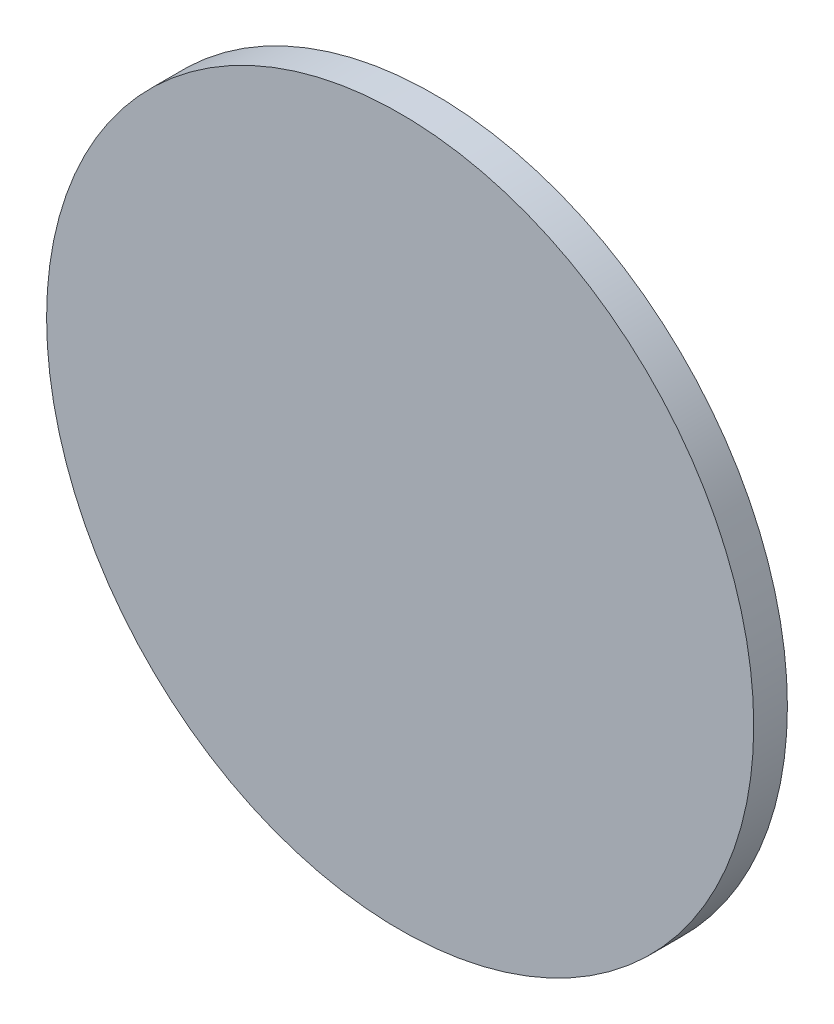
ISO-10303-21;
HEADER;
FILE_DESCRIPTION(('STEP AP214'),'2;1');
FILE_NAME('part.step','',(''),(''),'','','');
FILE_SCHEMA(('AUTOMOTIVE_DESIGN { 1 0 10303 214 1 1 1 1 }'));
ENDSEC;
DATA;
#1=APPLICATION_CONTEXT('core data for automotive mechanical design processes');
#2=APPLICATION_PROTOCOL_DEFINITION('international standard','automotive_design',2000,#1);
#3=PRODUCT_CONTEXT('',#1,'mechanical');
#4=PRODUCT('Part','Part','',(#3));
#5=PRODUCT_RELATED_PRODUCT_CATEGORY('part','',(#4));
#6=PRODUCT_DEFINITION_FORMATION('','',#4);
#7=PRODUCT_DEFINITION_CONTEXT('part definition',#1,'design');
#8=PRODUCT_DEFINITION('design','',#6,#7);
#9=PRODUCT_DEFINITION_SHAPE('','',#8);
#10=(LENGTH_UNIT() NAMED_UNIT(*) SI_UNIT(.MILLI.,.METRE.));
#11=(NAMED_UNIT(*) PLANE_ANGLE_UNIT() SI_UNIT($,.RADIAN.));
#12=(NAMED_UNIT(*) SI_UNIT($,.STERADIAN.) SOLID_ANGLE_UNIT());
#13=UNCERTAINTY_MEASURE_WITH_UNIT(LENGTH_MEASURE(1.E-05),#10,'distance_accuracy_value','');
#14=(GEOMETRIC_REPRESENTATION_CONTEXT(3) GLOBAL_UNCERTAINTY_ASSIGNED_CONTEXT((#13)) GLOBAL_UNIT_ASSIGNED_CONTEXT((#10,
#11,#12)) REPRESENTATION_CONTEXT('',''));
#15=CARTESIAN_POINT('',(0.,0.,0.));
#16=DIRECTION('',(0.,0.,1.));
#17=DIRECTION('',(1.,0.,0.));
#18=AXIS2_PLACEMENT_3D('',#15,#16,#17);
#19=CARTESIAN_POINT('',(0.,0.,2.));
#20=DIRECTION('',(0.,0.,-1.));
#21=DIRECTION('',(-1.,0.,0.));
#22=AXIS2_PLACEMENT_3D('',#19,#20,#21);
#23=CYLINDRICAL_SURFACE('',#22,21.);
#24=CARTESIAN_POINT('',(0.,0.,2.));
#25=DIRECTION('',(0.,0.,1.));
#26=DIRECTION('',(1.,0.,0.));
#27=AXIS2_PLACEMENT_3D('',#24,#25,#26);
#28=CIRCLE('',#27,21.);
#29=CARTESIAN_POINT('',(21.,0.,2.));
#30=VERTEX_POINT('',#29);
#31=EDGE_CURVE('E10',#30,#30,#28,.T.);
#32=ORIENTED_EDGE('',*,*,#31,.F.);
#33=EDGE_LOOP('',(#32));
#34=FACE_BOUND('',#33,.T.);
#35=CARTESIAN_POINT('',(0.,0.,0.));
#36=DIRECTION('',(0.,0.,1.));
#37=DIRECTION('',(1.,0.,0.));
#38=AXIS2_PLACEMENT_3D('',#35,#36,#37);
#39=CIRCLE('',#38,21.);
#40=CARTESIAN_POINT('',(21.,0.,0.));
#41=VERTEX_POINT('',#40);
#42=EDGE_CURVE('E42',#41,#41,#39,.T.);
#43=ORIENTED_EDGE('',*,*,#42,.T.);
#44=EDGE_LOOP('',(#43));
#45=FACE_BOUND('',#44,.T.);
#46=ADVANCED_FACE('F39',(#34,#45),#23,.T.);
#47=CARTESIAN_POINT('',(0.,0.,2.));
#48=DIRECTION('',(0.,0.,1.));
#49=DIRECTION('',(1.,0.,0.));
#50=AXIS2_PLACEMENT_3D('',#47,#48,#49);
#51=PLANE('',#50);
#52=ORIENTED_EDGE('',*,*,#31,.T.);
#53=EDGE_LOOP('',(#52));
#54=FACE_BOUND('',#53,.T.);
#55=ADVANCED_FACE('F54',(#54),#51,.T.);
#56=CARTESIAN_POINT('',(0.,0.,0.));
#57=DIRECTION('',(0.,0.,1.));
#58=DIRECTION('',(1.,0.,0.));
#59=AXIS2_PLACEMENT_3D('',#56,#57,#58);
#60=PLANE('',#59);
#61=ORIENTED_EDGE('',*,*,#42,.F.);
#62=EDGE_LOOP('',(#61));
#63=FACE_BOUND('',#62,.T.);
#64=ADVANCED_FACE('F52',(#63),#60,.F.);
#65=CLOSED_SHELL('',(#46,#55,#64));
#66=MANIFOLD_SOLID_BREP('B2',#65);
#67=ADVANCED_BREP_SHAPE_REPRESENTATION('',(#18,#66),#14);
#68=SHAPE_DEFINITION_REPRESENTATION(#9,#67);
ENDSEC;
END-ISO-10303-21;
